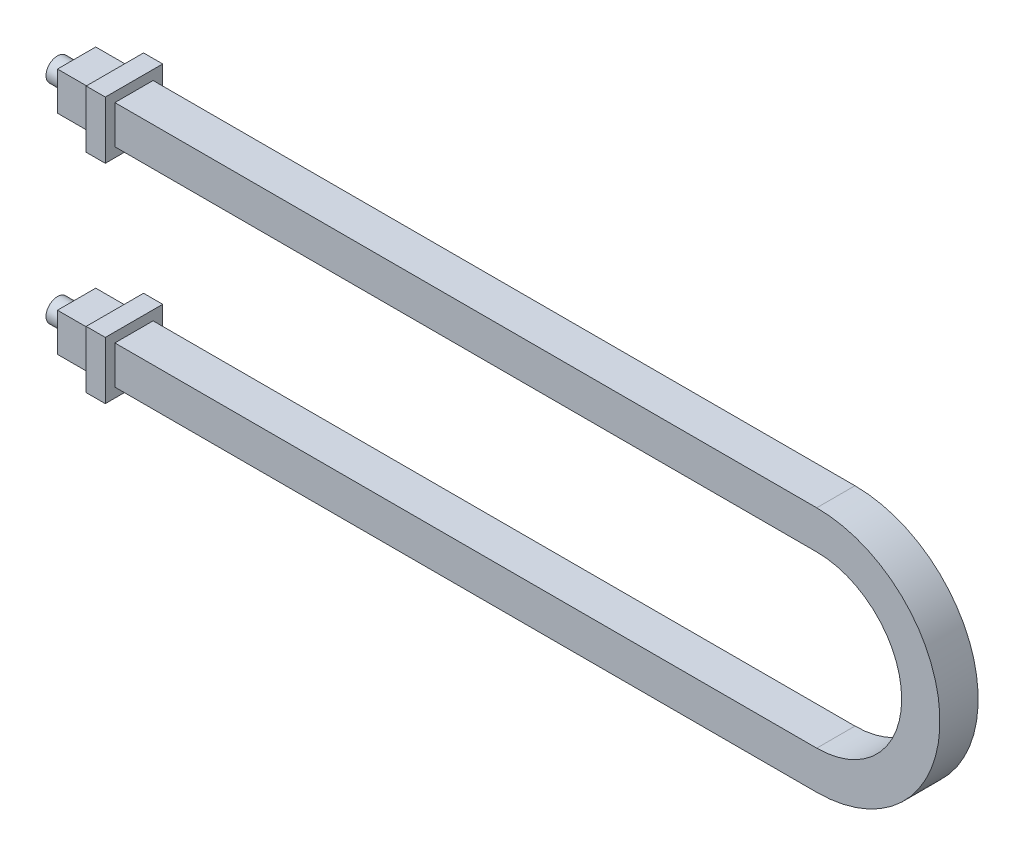
ISO-10303-21;
HEADER;
FILE_DESCRIPTION(('STEP AP214'),'2;1');
FILE_NAME('part.step','',(''),(''),'','','');
FILE_SCHEMA(('AUTOMOTIVE_DESIGN { 1 0 10303 214 1 1 1 1 }'));
ENDSEC;
DATA;
#1=APPLICATION_CONTEXT('core data for automotive mechanical design processes');
#2=APPLICATION_PROTOCOL_DEFINITION('international standard','automotive_design',2000,#1);
#3=PRODUCT_CONTEXT('',#1,'mechanical');
#4=PRODUCT('Part','Part','',(#3));
#5=PRODUCT_RELATED_PRODUCT_CATEGORY('part','',(#4));
#6=PRODUCT_DEFINITION_FORMATION('','',#4);
#7=PRODUCT_DEFINITION_CONTEXT('part definition',#1,'design');
#8=PRODUCT_DEFINITION('design','',#6,#7);
#9=PRODUCT_DEFINITION_SHAPE('','',#8);
#10=(LENGTH_UNIT() NAMED_UNIT(*) SI_UNIT(.MILLI.,.METRE.));
#11=(NAMED_UNIT(*) PLANE_ANGLE_UNIT() SI_UNIT($,.RADIAN.));
#12=(NAMED_UNIT(*) SI_UNIT($,.STERADIAN.) SOLID_ANGLE_UNIT());
#13=UNCERTAINTY_MEASURE_WITH_UNIT(LENGTH_MEASURE(1.E-05),#10,'distance_accuracy_value','');
#14=(GEOMETRIC_REPRESENTATION_CONTEXT(3) GLOBAL_UNCERTAINTY_ASSIGNED_CONTEXT((#13)) GLOBAL_UNIT_ASSIGNED_CONTEXT((#10,
#11,#12)) REPRESENTATION_CONTEXT('',''));
#15=CARTESIAN_POINT('',(0.,0.,0.));
#16=DIRECTION('',(0.,0.,1.));
#17=DIRECTION('',(1.,0.,0.));
#18=AXIS2_PLACEMENT_3D('',#15,#16,#17);
#19=CARTESIAN_POINT('',(0.,-54.4096844460773,10.));
#20=DIRECTION('',(1.,0.,0.));
#21=DIRECTION('',(0.,0.,-1.));
#22=AXIS2_PLACEMENT_3D('',#19,#20,#21);
#23=PLANE('',#22);
#24=DIRECTION('',(0.,1.,0.));
#25=VECTOR('',#24,1.);
#26=CARTESIAN_POINT('',(0.,-66.9096844460773,-2.5));
#27=LINE('',#26,#25);
#28=CARTESIAN_POINT('',(0.,-66.9096844460773,-2.5));
#29=VERTEX_POINT('',#28);
#30=CARTESIAN_POINT('',(0.,-51.9096844460773,-2.5));
#31=VERTEX_POINT('',#30);
#32=EDGE_CURVE('E284',#29,#31,#27,.T.);
#33=ORIENTED_EDGE('',*,*,#32,.F.);
#34=DIRECTION('',(0.,0.,-1.));
#35=VECTOR('',#34,1.);
#36=CARTESIAN_POINT('',(0.,-66.9096844460773,-2.5));
#37=LINE('',#36,#35);
#38=CARTESIAN_POINT('',(0.,-66.9096844460773,12.5));
#39=VERTEX_POINT('',#38);
#40=EDGE_CURVE('E277',#39,#29,#37,.T.);
#41=ORIENTED_EDGE('',*,*,#40,.F.);
#42=DIRECTION('',(0.,-1.,0.));
#43=VECTOR('',#42,1.);
#44=CARTESIAN_POINT('',(0.,-66.9096844460773,12.5));
#45=LINE('',#44,#43);
#46=CARTESIAN_POINT('',(0.,-51.9096844460773,12.5));
#47=VERTEX_POINT('',#46);
#48=EDGE_CURVE('E279',#47,#39,#45,.T.);
#49=ORIENTED_EDGE('',*,*,#48,.F.);
#50=DIRECTION('',(0.,0.,1.));
#51=VECTOR('',#50,1.);
#52=CARTESIAN_POINT('',(0.,-51.9096844460773,-2.5));
#53=LINE('',#52,#51);
#54=EDGE_CURVE('E282',#31,#47,#53,.T.);
#55=ORIENTED_EDGE('',*,*,#54,.F.);
#56=EDGE_LOOP('',(#33,#41,#49,#55));
#57=FACE_BOUND('',#56,.T.);
#58=DIRECTION('',(0.,-1.,0.));
#59=VECTOR('',#58,1.);
#60=CARTESIAN_POINT('',(0.,-64.5027045373639,0.));
#61=LINE('',#60,#59);
#62=CARTESIAN_POINT('',(0.,-54.5027045373639,0.));
#63=VERTEX_POINT('',#62);
#64=CARTESIAN_POINT('',(0.,-64.5027045373639,0.));
#65=VERTEX_POINT('',#64);
#66=EDGE_CURVE('E194',#63,#65,#61,.T.);
#67=ORIENTED_EDGE('',*,*,#66,.F.);
#68=DIRECTION('',(0.,0.,-1.));
#69=VECTOR('',#68,1.);
#70=CARTESIAN_POINT('',(0.,-54.5027045373639,0.));
#71=LINE('',#70,#69);
#72=CARTESIAN_POINT('',(0.,-54.5027045373639,10.));
#73=VERTEX_POINT('',#72);
#74=EDGE_CURVE('E196',#73,#63,#71,.T.);
#75=ORIENTED_EDGE('',*,*,#74,.F.);
#76=DIRECTION('',(0.,1.,0.));
#77=VECTOR('',#76,1.);
#78=CARTESIAN_POINT('',(0.,-64.5027045373639,10.));
#79=LINE('',#78,#77);
#80=CARTESIAN_POINT('',(0.,-64.5027045373639,10.));
#81=VERTEX_POINT('',#80);
#82=EDGE_CURVE('E57',#81,#73,#79,.T.);
#83=ORIENTED_EDGE('',*,*,#82,.F.);
#84=DIRECTION('',(0.,0.,1.));
#85=VECTOR('',#84,1.);
#86=CARTESIAN_POINT('',(0.,-64.5027045373639,0.));
#87=LINE('',#86,#85);
#88=EDGE_CURVE('E52',#65,#81,#87,.T.);
#89=ORIENTED_EDGE('',*,*,#88,.F.);
#90=EDGE_LOOP('',(#67,#75,#83,#89));
#91=FACE_BOUND('',#90,.T.);
#92=ADVANCED_FACE('F37',(#57,#91),#23,.F.);
#93=CARTESIAN_POINT('',(0.,-10.,10.));
#94=DIRECTION('',(0.,1.,0.));
#95=DIRECTION('',(0.,0.,1.));
#96=AXIS2_PLACEMENT_3D('',#93,#94,#95);
#97=PLANE('',#96);
#98=DIRECTION('',(0.,0.,1.));
#99=VECTOR('',#98,1.);
#100=CARTESIAN_POINT('',(4.99999999999999,-10.,10.));
#101=LINE('',#100,#99);
#102=CARTESIAN_POINT('',(5.,-10.,0.));
#103=VERTEX_POINT('',#102);
#104=CARTESIAN_POINT('',(4.99999999999999,-10.,10.));
#105=VERTEX_POINT('',#104);
#106=EDGE_CURVE('E260',#103,#105,#101,.T.);
#107=ORIENTED_EDGE('',*,*,#106,.F.);
#108=DIRECTION('',(1.,0.,0.));
#109=VECTOR('',#108,1.);
#110=CARTESIAN_POINT('',(0.,-10.,0.));
#111=LINE('',#110,#109);
#112=CARTESIAN_POINT('',(188.467924538912,-10.,0.));
#113=VERTEX_POINT('',#112);
#114=EDGE_CURVE('E340',#103,#113,#111,.T.);
#115=ORIENTED_EDGE('',*,*,#114,.T.);
#116=DIRECTION('',(0.,0.,-1.));
#117=VECTOR('',#116,1.);
#118=CARTESIAN_POINT('',(188.467924538912,-10.,10.));
#119=LINE('',#118,#117);
#120=CARTESIAN_POINT('',(188.467924538912,-10.,10.));
#121=VERTEX_POINT('',#120);
#122=EDGE_CURVE('E377',#121,#113,#119,.T.);
#123=ORIENTED_EDGE('',*,*,#122,.F.);
#124=DIRECTION('',(1.,0.,0.));
#125=VECTOR('',#124,1.);
#126=CARTESIAN_POINT('',(0.,-10.,10.));
#127=LINE('',#126,#125);
#128=EDGE_CURVE('E341',#105,#121,#127,.T.);
#129=ORIENTED_EDGE('',*,*,#128,.F.);
#130=EDGE_LOOP('',(#107,#115,#123,#129));
#131=FACE_BOUND('',#130,.T.);
#132=ADVANCED_FACE('F424',(#131),#97,.F.);
#133=CARTESIAN_POINT('',(0.,0.,10.));
#134=DIRECTION('',(0.,-1.,0.));
#135=DIRECTION('',(0.,0.,-1.));
#136=AXIS2_PLACEMENT_3D('',#133,#134,#135);
#137=PLANE('',#136);
#138=DIRECTION('',(0.,0.,-1.));
#139=VECTOR('',#138,1.);
#140=CARTESIAN_POINT('',(4.99999999999999,0.,10.));
#141=LINE('',#140,#139);
#142=CARTESIAN_POINT('',(4.99999999999999,0.,10.));
#143=VERTEX_POINT('',#142);
#144=CARTESIAN_POINT('',(5.,0.,0.));
#145=VERTEX_POINT('',#144);
#146=EDGE_CURVE('E258',#143,#145,#141,.T.);
#147=ORIENTED_EDGE('',*,*,#146,.F.);
#148=DIRECTION('',(-1.,0.,0.));
#149=VECTOR('',#148,1.);
#150=CARTESIAN_POINT('',(0.,0.,10.));
#151=LINE('',#150,#149);
#152=CARTESIAN_POINT('',(188.467924538912,0.,10.));
#153=VERTEX_POINT('',#152);
#154=EDGE_CURVE('E353',#153,#143,#151,.T.);
#155=ORIENTED_EDGE('',*,*,#154,.F.);
#156=DIRECTION('',(0.,0.,-1.));
#157=VECTOR('',#156,1.);
#158=CARTESIAN_POINT('',(188.467924538912,0.,10.));
#159=LINE('',#158,#157);
#160=CARTESIAN_POINT('',(188.467924538912,0.,0.));
#161=VERTEX_POINT('',#160);
#162=EDGE_CURVE('E356',#153,#161,#159,.T.);
#163=ORIENTED_EDGE('',*,*,#162,.T.);
#164=DIRECTION('',(-1.,0.,0.));
#165=VECTOR('',#164,1.);
#166=CARTESIAN_POINT('',(0.,0.,0.));
#167=LINE('',#166,#165);
#168=EDGE_CURVE('E344',#161,#145,#167,.T.);
#169=ORIENTED_EDGE('',*,*,#168,.T.);
#170=EDGE_LOOP('',(#147,#155,#163,#169));
#171=FACE_BOUND('',#170,.T.);
#172=ADVANCED_FACE('F395',(#171),#137,.F.);
#173=CARTESIAN_POINT('',(188.467924538912,-32.2048422230386,10.));
#174=DIRECTION('',(0.,0.,-1.));
#175=DIRECTION('',(-1.,0.,0.));
#176=AXIS2_PLACEMENT_3D('',#173,#174,#175);
#177=PLANE('',#176);
#178=DIRECTION('',(0.,1.,0.));
#179=VECTOR('',#178,1.);
#180=CARTESIAN_POINT('',(5.,-32.2048422230386,10.));
#181=LINE('',#180,#179);
#182=EDGE_CURVE('E262',#105,#143,#181,.T.);
#183=ORIENTED_EDGE('',*,*,#182,.F.);
#184=ORIENTED_EDGE('',*,*,#128,.T.);
#185=CARTESIAN_POINT('',(188.467924538912,-32.2048422230386,10.));
#186=DIRECTION('',(0.,0.,-1.));
#187=DIRECTION('',(-1.,0.,0.));
#188=AXIS2_PLACEMENT_3D('',#185,#186,#187);
#189=CIRCLE('',#188,22.2048422230386);
#190=CARTESIAN_POINT('',(188.467924538912,-54.4096844460773,10.));
#191=VERTEX_POINT('',#190);
#192=EDGE_CURVE('E343',#121,#191,#189,.T.);
#193=ORIENTED_EDGE('',*,*,#192,.T.);
#194=DIRECTION('',(-1.,0.,0.));
#195=VECTOR('',#194,1.);
#196=CARTESIAN_POINT('',(188.467924538912,-54.4096844460773,10.));
#197=LINE('',#196,#195);
#198=CARTESIAN_POINT('',(5.00000000000006,-54.4096844460773,10.));
#199=VERTEX_POINT('',#198);
#200=EDGE_CURVE('E346',#191,#199,#197,.T.);
#201=ORIENTED_EDGE('',*,*,#200,.T.);
#202=DIRECTION('',(0.,-1.,0.));
#203=VECTOR('',#202,1.);
#204=CARTESIAN_POINT('',(5.,-32.2048422230386,10.));
#205=LINE('',#204,#203);
#206=CARTESIAN_POINT('',(5.,-64.4096844460773,10.));
#207=VERTEX_POINT('',#206);
#208=EDGE_CURVE('E299',#199,#207,#205,.T.);
#209=ORIENTED_EDGE('',*,*,#208,.T.);
#210=DIRECTION('',(1.,0.,0.));
#211=VECTOR('',#210,1.);
#212=CARTESIAN_POINT('',(188.467924538912,-64.4096844460773,10.));
#213=LINE('',#212,#211);
#214=CARTESIAN_POINT('',(188.467924538912,-64.4096844460773,10.));
#215=VERTEX_POINT('',#214);
#216=EDGE_CURVE('E349',#207,#215,#213,.T.);
#217=ORIENTED_EDGE('',*,*,#216,.T.);
#218=CARTESIAN_POINT('',(188.467924538912,-32.2048422230386,10.));
#219=DIRECTION('',(0.,0.,1.));
#220=DIRECTION('',(-1.,0.,0.));
#221=AXIS2_PLACEMENT_3D('',#218,#219,#220);
#222=CIRCLE('',#221,32.2048422230386);
#223=EDGE_CURVE('E351',#215,#153,#222,.T.);
#224=ORIENTED_EDGE('',*,*,#223,.T.);
#225=ORIENTED_EDGE('',*,*,#154,.T.);
#226=EDGE_LOOP('',(#183,#184,#193,#201,#209,#217,#224,#225));
#227=FACE_BOUND('',#226,.T.);
#228=ADVANCED_FACE('F416',(#227),#177,.F.);
#229=CARTESIAN_POINT('',(188.467924538912,-32.2048422230386,0.));
#230=DIRECTION('',(0.,0.,-1.));
#231=DIRECTION('',(-1.,0.,0.));
#232=AXIS2_PLACEMENT_3D('',#229,#230,#231);
#233=PLANE('',#232);
#234=ORIENTED_EDGE('',*,*,#114,.F.);
#235=DIRECTION('',(0.,1.,0.));
#236=VECTOR('',#235,1.);
#237=CARTESIAN_POINT('',(5.,-32.2048422230386,0.));
#238=LINE('',#237,#236);
#239=EDGE_CURVE('E45',#103,#145,#238,.T.);
#240=ORIENTED_EDGE('',*,*,#239,.T.);
#241=ORIENTED_EDGE('',*,*,#168,.F.);
#242=CARTESIAN_POINT('',(188.467924538912,-32.2048422230386,0.));
#243=DIRECTION('',(0.,0.,1.));
#244=DIRECTION('',(-1.,0.,0.));
#245=AXIS2_PLACEMENT_3D('',#242,#243,#244);
#246=CIRCLE('',#245,32.2048422230386);
#247=CARTESIAN_POINT('',(188.467924538912,-64.4096844460773,0.));
#248=VERTEX_POINT('',#247);
#249=EDGE_CURVE('E365',#248,#161,#246,.T.);
#250=ORIENTED_EDGE('',*,*,#249,.F.);
#251=DIRECTION('',(1.,0.,0.));
#252=VECTOR('',#251,1.);
#253=CARTESIAN_POINT('',(188.467924538912,-64.4096844460773,0.));
#254=LINE('',#253,#252);
#255=CARTESIAN_POINT('',(5.,-64.4096844460773,0.));
#256=VERTEX_POINT('',#255);
#257=EDGE_CURVE('E363',#256,#248,#254,.T.);
#258=ORIENTED_EDGE('',*,*,#257,.F.);
#259=DIRECTION('',(0.,-1.,0.));
#260=VECTOR('',#259,1.);
#261=CARTESIAN_POINT('',(5.,-32.2048422230386,0.));
#262=LINE('',#261,#260);
#263=CARTESIAN_POINT('',(5.00000000000006,-54.4096844460773,0.));
#264=VERTEX_POINT('',#263);
#265=EDGE_CURVE('E380',#264,#256,#262,.T.);
#266=ORIENTED_EDGE('',*,*,#265,.F.);
#267=DIRECTION('',(-1.,0.,0.));
#268=VECTOR('',#267,1.);
#269=CARTESIAN_POINT('',(188.467924538912,-54.4096844460773,0.));
#270=LINE('',#269,#268);
#271=CARTESIAN_POINT('',(188.467924538912,-54.4096844460773,0.));
#272=VERTEX_POINT('',#271);
#273=EDGE_CURVE('E360',#272,#264,#270,.T.);
#274=ORIENTED_EDGE('',*,*,#273,.F.);
#275=CARTESIAN_POINT('',(188.467924538912,-32.2048422230386,0.));
#276=DIRECTION('',(0.,0.,-1.));
#277=DIRECTION('',(-1.,0.,0.));
#278=AXIS2_PLACEMENT_3D('',#275,#276,#277);
#279=CIRCLE('',#278,22.2048422230386);
#280=EDGE_CURVE('E358',#113,#272,#279,.T.);
#281=ORIENTED_EDGE('',*,*,#280,.F.);
#282=EDGE_LOOP('',(#234,#240,#241,#250,#258,#266,#274,#281));
#283=FACE_BOUND('',#282,.T.);
#284=ADVANCED_FACE('F388',(#283),#233,.T.);
#285=CARTESIAN_POINT('',(188.467924538912,-32.2048422230386,10.));
#286=DIRECTION('',(0.,0.,-1.));
#287=DIRECTION('',(-1.,0.,0.));
#288=AXIS2_PLACEMENT_3D('',#285,#286,#287);
#289=CYLINDRICAL_SURFACE('',#288,22.2048422230386);
#290=ORIENTED_EDGE('',*,*,#280,.T.);
#291=DIRECTION('',(0.,0.,-1.));
#292=VECTOR('',#291,1.);
#293=CARTESIAN_POINT('',(188.467924538912,-54.4096844460773,10.));
#294=LINE('',#293,#292);
#295=EDGE_CURVE('E374',#191,#272,#294,.T.);
#296=ORIENTED_EDGE('',*,*,#295,.F.);
#297=ORIENTED_EDGE('',*,*,#192,.F.);
#298=ORIENTED_EDGE('',*,*,#122,.T.);
#299=EDGE_LOOP('',(#290,#296,#297,#298));
#300=FACE_BOUND('',#299,.T.);
#301=ADVANCED_FACE('F422',(#300),#289,.F.);
#302=CARTESIAN_POINT('',(188.467924538912,-54.4096844460773,10.));
#303=DIRECTION('',(0.,-1.,0.));
#304=DIRECTION('',(0.,0.,-1.));
#305=AXIS2_PLACEMENT_3D('',#302,#303,#304);
#306=PLANE('',#305);
#307=ORIENTED_EDGE('',*,*,#273,.T.);
#308=DIRECTION('',(0.,0.,1.));
#309=VECTOR('',#308,1.);
#310=CARTESIAN_POINT('',(5.,-54.4096844460773,10.));
#311=LINE('',#310,#309);
#312=EDGE_CURVE('E297',#264,#199,#311,.T.);
#313=ORIENTED_EDGE('',*,*,#312,.T.);
#314=ORIENTED_EDGE('',*,*,#200,.F.);
#315=ORIENTED_EDGE('',*,*,#295,.T.);
#316=EDGE_LOOP('',(#307,#313,#314,#315));
#317=FACE_BOUND('',#316,.T.);
#318=ADVANCED_FACE('F413',(#317),#306,.F.);
#319=CARTESIAN_POINT('',(188.467924538912,-64.4096844460773,10.));
#320=DIRECTION('',(0.,1.,0.));
#321=DIRECTION('',(0.,0.,1.));
#322=AXIS2_PLACEMENT_3D('',#319,#320,#321);
#323=PLANE('',#322);
#324=ORIENTED_EDGE('',*,*,#216,.F.);
#325=DIRECTION('',(0.,0.,-1.));
#326=VECTOR('',#325,1.);
#327=CARTESIAN_POINT('',(5.,-64.4096844460773,10.));
#328=LINE('',#327,#326);
#329=EDGE_CURVE('E287',#207,#256,#328,.T.);
#330=ORIENTED_EDGE('',*,*,#329,.T.);
#331=ORIENTED_EDGE('',*,*,#257,.T.);
#332=DIRECTION('',(0.,0.,-1.));
#333=VECTOR('',#332,1.);
#334=CARTESIAN_POINT('',(188.467924538912,-64.4096844460773,10.));
#335=LINE('',#334,#333);
#336=EDGE_CURVE('E371',#215,#248,#335,.T.);
#337=ORIENTED_EDGE('',*,*,#336,.F.);
#338=EDGE_LOOP('',(#324,#330,#331,#337));
#339=FACE_BOUND('',#338,.T.);
#340=ADVANCED_FACE('F406',(#339),#323,.F.);
#341=CARTESIAN_POINT('',(188.467924538912,-32.2048422230386,10.));
#342=DIRECTION('',(0.,0.,-1.));
#343=DIRECTION('',(-1.,0.,0.));
#344=AXIS2_PLACEMENT_3D('',#341,#342,#343);
#345=CYLINDRICAL_SURFACE('',#344,32.2048422230386);
#346=ORIENTED_EDGE('',*,*,#249,.T.);
#347=ORIENTED_EDGE('',*,*,#162,.F.);
#348=ORIENTED_EDGE('',*,*,#223,.F.);
#349=ORIENTED_EDGE('',*,*,#336,.T.);
#350=EDGE_LOOP('',(#346,#347,#348,#349));
#351=FACE_BOUND('',#350,.T.);
#352=ADVANCED_FACE('F400',(#351),#345,.T.);
#353=CARTESIAN_POINT('',(4.99999999999999,0.,0.));
#354=DIRECTION('',(1.,0.,0.));
#355=DIRECTION('',(0.,0.,-1.));
#356=AXIS2_PLACEMENT_3D('',#353,#354,#355);
#357=PLANE('',#356);
#358=DIRECTION('',(0.,1.,0.));
#359=VECTOR('',#358,1.);
#360=CARTESIAN_POINT('',(4.99999999999999,-66.9096844460773,-2.5));
#361=LINE('',#360,#359);
#362=CARTESIAN_POINT('',(4.99999999999999,-66.9096844460773,-2.5));
#363=VERTEX_POINT('',#362);
#364=CARTESIAN_POINT('',(4.99999999999999,-51.9096844460773,-2.5));
#365=VERTEX_POINT('',#364);
#366=EDGE_CURVE('E280',#363,#365,#361,.T.);
#367=ORIENTED_EDGE('',*,*,#366,.T.);
#368=DIRECTION('',(0.,0.,1.));
#369=VECTOR('',#368,1.);
#370=CARTESIAN_POINT('',(4.99999999999999,-51.9096844460773,-2.5));
#371=LINE('',#370,#369);
#372=CARTESIAN_POINT('',(4.99999999999999,-51.9096844460773,12.5));
#373=VERTEX_POINT('',#372);
#374=EDGE_CURVE('E291',#365,#373,#371,.T.);
#375=ORIENTED_EDGE('',*,*,#374,.T.);
#376=DIRECTION('',(0.,-1.,0.));
#377=VECTOR('',#376,1.);
#378=CARTESIAN_POINT('',(4.99999999999999,-66.9096844460773,12.5));
#379=LINE('',#378,#377);
#380=CARTESIAN_POINT('',(4.99999999999999,-66.9096844460773,12.5));
#381=VERTEX_POINT('',#380);
#382=EDGE_CURVE('E289',#373,#381,#379,.T.);
#383=ORIENTED_EDGE('',*,*,#382,.T.);
#384=DIRECTION('',(0.,0.,-1.));
#385=VECTOR('',#384,1.);
#386=CARTESIAN_POINT('',(4.99999999999999,-66.9096844460773,-2.5));
#387=LINE('',#386,#385);
#388=EDGE_CURVE('E276',#381,#363,#387,.T.);
#389=ORIENTED_EDGE('',*,*,#388,.T.);
#390=EDGE_LOOP('',(#367,#375,#383,#389));
#391=FACE_BOUND('',#390,.T.);
#392=ORIENTED_EDGE('',*,*,#208,.F.);
#393=ORIENTED_EDGE('',*,*,#312,.F.);
#394=ORIENTED_EDGE('',*,*,#265,.T.);
#395=ORIENTED_EDGE('',*,*,#329,.F.);
#396=EDGE_LOOP('',(#392,#393,#394,#395));
#397=FACE_BOUND('',#396,.T.);
#398=ADVANCED_FACE('F410',(#391,#397),#357,.T.);
#399=CARTESIAN_POINT('',(4.99999999999999,-66.9096844460773,-2.5));
#400=DIRECTION('',(0.,0.,1.));
#401=DIRECTION('',(0.,-1.,0.));
#402=AXIS2_PLACEMENT_3D('',#399,#400,#401);
#403=PLANE('',#402);
#404=ORIENTED_EDGE('',*,*,#32,.T.);
#405=DIRECTION('',(-1.,0.,0.));
#406=VECTOR('',#405,1.);
#407=CARTESIAN_POINT('',(4.99999999999999,-51.9096844460773,-2.5));
#408=LINE('',#407,#406);
#409=EDGE_CURVE('E264',#365,#31,#408,.T.);
#410=ORIENTED_EDGE('',*,*,#409,.F.);
#411=ORIENTED_EDGE('',*,*,#366,.F.);
#412=DIRECTION('',(-1.,0.,0.));
#413=VECTOR('',#412,1.);
#414=CARTESIAN_POINT('',(4.99999999999999,-66.9096844460773,-2.5));
#415=LINE('',#414,#413);
#416=EDGE_CURVE('E273',#363,#29,#415,.T.);
#417=ORIENTED_EDGE('',*,*,#416,.T.);
#418=EDGE_LOOP('',(#404,#410,#411,#417));
#419=FACE_BOUND('',#418,.T.);
#420=ADVANCED_FACE('F670',(#419),#403,.F.);
#421=CARTESIAN_POINT('',(4.99999999999999,-51.9096844460773,-2.5));
#422=DIRECTION('',(0.,-1.,0.));
#423=DIRECTION('',(0.,0.,-1.));
#424=AXIS2_PLACEMENT_3D('',#421,#422,#423);
#425=PLANE('',#424);
#426=ORIENTED_EDGE('',*,*,#54,.T.);
#427=DIRECTION('',(-1.,0.,0.));
#428=VECTOR('',#427,1.);
#429=CARTESIAN_POINT('',(4.99999999999999,-51.9096844460773,12.5));
#430=LINE('',#429,#428);
#431=EDGE_CURVE('E267',#373,#47,#430,.T.);
#432=ORIENTED_EDGE('',*,*,#431,.F.);
#433=ORIENTED_EDGE('',*,*,#374,.F.);
#434=ORIENTED_EDGE('',*,*,#409,.T.);
#435=EDGE_LOOP('',(#426,#432,#433,#434));
#436=FACE_BOUND('',#435,.T.);
#437=ADVANCED_FACE('F681',(#436),#425,.F.);
#438=CARTESIAN_POINT('',(4.99999999999999,-66.9096844460773,12.5));
#439=DIRECTION('',(0.,0.,-1.));
#440=DIRECTION('',(0.,1.,0.));
#441=AXIS2_PLACEMENT_3D('',#438,#439,#440);
#442=PLANE('',#441);
#443=ORIENTED_EDGE('',*,*,#48,.T.);
#444=DIRECTION('',(-1.,0.,0.));
#445=VECTOR('',#444,1.);
#446=CARTESIAN_POINT('',(4.99999999999999,-66.9096844460773,12.5));
#447=LINE('',#446,#445);
#448=EDGE_CURVE('E270',#381,#39,#447,.T.);
#449=ORIENTED_EDGE('',*,*,#448,.F.);
#450=ORIENTED_EDGE('',*,*,#382,.F.);
#451=ORIENTED_EDGE('',*,*,#431,.T.);
#452=EDGE_LOOP('',(#443,#449,#450,#451));
#453=FACE_BOUND('',#452,.T.);
#454=ADVANCED_FACE('F438',(#453),#442,.F.);
#455=CARTESIAN_POINT('',(4.99999999999999,-66.9096844460773,-2.5));
#456=DIRECTION('',(0.,1.,0.));
#457=DIRECTION('',(0.,0.,1.));
#458=AXIS2_PLACEMENT_3D('',#455,#456,#457);
#459=PLANE('',#458);
#460=ORIENTED_EDGE('',*,*,#40,.T.);
#461=ORIENTED_EDGE('',*,*,#416,.F.);
#462=ORIENTED_EDGE('',*,*,#388,.F.);
#463=ORIENTED_EDGE('',*,*,#448,.T.);
#464=EDGE_LOOP('',(#460,#461,#462,#463));
#465=FACE_BOUND('',#464,.T.);
#466=ADVANCED_FACE('F428',(#465),#459,.F.);
#467=CARTESIAN_POINT('',(4.99999999999999,0.,0.));
#468=DIRECTION('',(-1.,0.,0.));
#469=DIRECTION('',(0.,0.,1.));
#470=AXIS2_PLACEMENT_3D('',#467,#468,#469);
#471=PLANE('',#470);
#472=DIRECTION('',(0.,-1.,0.));
#473=VECTOR('',#472,1.);
#474=CARTESIAN_POINT('',(4.99999999999999,2.5,12.5));
#475=LINE('',#474,#473);
#476=CARTESIAN_POINT('',(4.99999999999999,2.5,12.5));
#477=VERTEX_POINT('',#476);
#478=CARTESIAN_POINT('',(4.99999999999999,-12.5,12.5));
#479=VERTEX_POINT('',#478);
#480=EDGE_CURVE('E229',#477,#479,#475,.T.);
#481=ORIENTED_EDGE('',*,*,#480,.T.);
#482=DIRECTION('',(0.,0.,-1.));
#483=VECTOR('',#482,1.);
#484=CARTESIAN_POINT('',(4.99999999999999,-12.5,-2.5));
#485=LINE('',#484,#483);
#486=CARTESIAN_POINT('',(4.99999999999999,-12.5,-2.5));
#487=VERTEX_POINT('',#486);
#488=EDGE_CURVE('E232',#479,#487,#485,.T.);
#489=ORIENTED_EDGE('',*,*,#488,.T.);
#490=DIRECTION('',(0.,1.,0.));
#491=VECTOR('',#490,1.);
#492=CARTESIAN_POINT('',(4.99999999999999,2.5,-2.5));
#493=LINE('',#492,#491);
#494=CARTESIAN_POINT('',(4.99999999999999,2.5,-2.5));
#495=VERTEX_POINT('',#494);
#496=EDGE_CURVE('E235',#487,#495,#493,.T.);
#497=ORIENTED_EDGE('',*,*,#496,.T.);
#498=DIRECTION('',(0.,0.,1.));
#499=VECTOR('',#498,1.);
#500=CARTESIAN_POINT('',(4.99999999999999,2.5,-2.5));
#501=LINE('',#500,#499);
#502=EDGE_CURVE('E237',#495,#477,#501,.T.);
#503=ORIENTED_EDGE('',*,*,#502,.T.);
#504=EDGE_LOOP('',(#481,#489,#497,#503));
#505=FACE_BOUND('',#504,.T.);
#506=ORIENTED_EDGE('',*,*,#106,.T.);
#507=ORIENTED_EDGE('',*,*,#182,.T.);
#508=ORIENTED_EDGE('',*,*,#146,.T.);
#509=ORIENTED_EDGE('',*,*,#239,.F.);
#510=EDGE_LOOP('',(#506,#507,#508,#509));
#511=FACE_BOUND('',#510,.T.);
#512=ADVANCED_FACE('F425',(#505,#511),#471,.F.);
#513=CARTESIAN_POINT('',(4.99999999999999,2.5,12.5));
#514=DIRECTION('',(0.,0.,-1.));
#515=DIRECTION('',(0.,1.,0.));
#516=AXIS2_PLACEMENT_3D('',#513,#514,#515);
#517=PLANE('',#516);
#518=DIRECTION('',(0.,-1.,0.));
#519=VECTOR('',#518,1.);
#520=CARTESIAN_POINT('',(0.,2.5,12.5));
#521=LINE('',#520,#519);
#522=CARTESIAN_POINT('',(0.,2.5,12.5));
#523=VERTEX_POINT('',#522);
#524=CARTESIAN_POINT('',(0.,-12.5,12.5));
#525=VERTEX_POINT('',#524);
#526=EDGE_CURVE('E200',#523,#525,#521,.T.);
#527=ORIENTED_EDGE('',*,*,#526,.T.);
#528=DIRECTION('',(-1.,0.,0.));
#529=VECTOR('',#528,1.);
#530=CARTESIAN_POINT('',(4.99999999999999,-12.5,12.5));
#531=LINE('',#530,#529);
#532=EDGE_CURVE('E255',#479,#525,#531,.T.);
#533=ORIENTED_EDGE('',*,*,#532,.F.);
#534=ORIENTED_EDGE('',*,*,#480,.F.);
#535=DIRECTION('',(-1.,0.,0.));
#536=VECTOR('',#535,1.);
#537=CARTESIAN_POINT('',(4.99999999999999,2.5,12.5));
#538=LINE('',#537,#536);
#539=EDGE_CURVE('E239',#477,#523,#538,.T.);
#540=ORIENTED_EDGE('',*,*,#539,.T.);
#541=EDGE_LOOP('',(#527,#533,#534,#540));
#542=FACE_BOUND('',#541,.T.);
#543=ADVANCED_FACE('F427',(#542),#517,.F.);
#544=CARTESIAN_POINT('',(4.99999999999999,-12.5,-2.5));
#545=DIRECTION('',(0.,1.,0.));
#546=DIRECTION('',(0.,0.,1.));
#547=AXIS2_PLACEMENT_3D('',#544,#545,#546);
#548=PLANE('',#547);
#549=DIRECTION('',(0.,0.,-1.));
#550=VECTOR('',#549,1.);
#551=CARTESIAN_POINT('',(0.,-12.5,-2.5));
#552=LINE('',#551,#550);
#553=CARTESIAN_POINT('',(0.,-12.5,-2.5));
#554=VERTEX_POINT('',#553);
#555=EDGE_CURVE('E242',#525,#554,#552,.T.);
#556=ORIENTED_EDGE('',*,*,#555,.T.);
#557=DIRECTION('',(-1.,0.,0.));
#558=VECTOR('',#557,1.);
#559=CARTESIAN_POINT('',(4.99999999999999,-12.5,-2.5));
#560=LINE('',#559,#558);
#561=EDGE_CURVE('E252',#487,#554,#560,.T.);
#562=ORIENTED_EDGE('',*,*,#561,.F.);
#563=ORIENTED_EDGE('',*,*,#488,.F.);
#564=ORIENTED_EDGE('',*,*,#532,.T.);
#565=EDGE_LOOP('',(#556,#562,#563,#564));
#566=FACE_BOUND('',#565,.T.);
#567=ADVANCED_FACE('F435',(#566),#548,.F.);
#568=CARTESIAN_POINT('',(4.99999999999999,2.5,-2.5));
#569=DIRECTION('',(0.,0.,1.));
#570=DIRECTION('',(0.,-1.,0.));
#571=AXIS2_PLACEMENT_3D('',#568,#569,#570);
#572=PLANE('',#571);
#573=DIRECTION('',(0.,1.,0.));
#574=VECTOR('',#573,1.);
#575=CARTESIAN_POINT('',(0.,2.5,-2.5));
#576=LINE('',#575,#574);
#577=CARTESIAN_POINT('',(0.,2.5,-2.5));
#578=VERTEX_POINT('',#577);
#579=EDGE_CURVE('E244',#554,#578,#576,.T.);
#580=ORIENTED_EDGE('',*,*,#579,.T.);
#581=DIRECTION('',(-1.,0.,0.));
#582=VECTOR('',#581,1.);
#583=CARTESIAN_POINT('',(4.99999999999999,2.5,-2.5));
#584=LINE('',#583,#582);
#585=EDGE_CURVE('E249',#495,#578,#584,.T.);
#586=ORIENTED_EDGE('',*,*,#585,.F.);
#587=ORIENTED_EDGE('',*,*,#496,.F.);
#588=ORIENTED_EDGE('',*,*,#561,.T.);
#589=EDGE_LOOP('',(#580,#586,#587,#588));
#590=FACE_BOUND('',#589,.T.);
#591=ADVANCED_FACE('F725',(#590),#572,.F.);
#592=CARTESIAN_POINT('',(4.99999999999999,2.5,-2.5));
#593=DIRECTION('',(0.,-1.,0.));
#594=DIRECTION('',(0.,0.,-1.));
#595=AXIS2_PLACEMENT_3D('',#592,#593,#594);
#596=PLANE('',#595);
#597=DIRECTION('',(0.,0.,1.));
#598=VECTOR('',#597,1.);
#599=CARTESIAN_POINT('',(0.,2.5,-2.5));
#600=LINE('',#599,#598);
#601=EDGE_CURVE('E233',#578,#523,#600,.T.);
#602=ORIENTED_EDGE('',*,*,#601,.T.);
#603=ORIENTED_EDGE('',*,*,#539,.F.);
#604=ORIENTED_EDGE('',*,*,#502,.F.);
#605=ORIENTED_EDGE('',*,*,#585,.T.);
#606=EDGE_LOOP('',(#602,#603,#604,#605));
#607=FACE_BOUND('',#606,.T.);
#608=ADVANCED_FACE('F507',(#607),#596,.F.);
#609=CARTESIAN_POINT('',(-15.,-4.90697990871341,5.));
#610=DIRECTION('',(-1.,0.,0.));
#611=DIRECTION('',(0.,0.,1.));
#612=AXIS2_PLACEMENT_3D('',#609,#610,#611);
#613=PLANE('',#612);
#614=CARTESIAN_POINT('',(-15.,-4.90697990871341,5.));
#615=DIRECTION('',(-1.,0.,0.));
#616=DIRECTION('',(0.,0.,1.));
#617=AXIS2_PLACEMENT_3D('',#614,#615,#616);
#618=CIRCLE('',#617,3.);
#619=CARTESIAN_POINT('',(-15.,-4.90697990871341,8.));
#620=VERTEX_POINT('',#619);
#621=EDGE_CURVE('E337',#620,#620,#618,.T.);
#622=ORIENTED_EDGE('',*,*,#621,.T.);
#623=EDGE_LOOP('',(#622));
#624=FACE_BOUND('',#623,.T.);
#625=ADVANCED_FACE('F503',(#624),#613,.T.);
#626=CARTESIAN_POINT('',(-15.,-4.90697990871341,5.));
#627=DIRECTION('',(1.,0.,0.));
#628=DIRECTION('',(0.,0.,-1.));
#629=AXIS2_PLACEMENT_3D('',#626,#627,#628);
#630=CYLINDRICAL_SURFACE('',#629,3.);
#631=CARTESIAN_POINT('',(-9.99999999999999,-4.90697990871341,5.));
#632=DIRECTION('',(-1.,0.,0.));
#633=DIRECTION('',(0.,0.,1.));
#634=AXIS2_PLACEMENT_3D('',#631,#632,#633);
#635=CIRCLE('',#634,3.);
#636=CARTESIAN_POINT('',(-9.99999999999999,-4.90697990871341,8.));
#637=VERTEX_POINT('',#636);
#638=EDGE_CURVE('E336',#637,#637,#635,.T.);
#639=ORIENTED_EDGE('',*,*,#638,.T.);
#640=EDGE_LOOP('',(#639));
#641=FACE_BOUND('',#640,.T.);
#642=ORIENTED_EDGE('',*,*,#621,.F.);
#643=EDGE_LOOP('',(#642));
#644=FACE_BOUND('',#643,.T.);
#645=ADVANCED_FACE('F506',(#641,#644),#630,.T.);
#646=CARTESIAN_POINT('',(0.,-10.,10.));
#647=DIRECTION('',(1.,0.,0.));
#648=DIRECTION('',(0.,0.,-1.));
#649=AXIS2_PLACEMENT_3D('',#646,#647,#648);
#650=PLANE('',#649);
#651=DIRECTION('',(0.,0.,1.));
#652=VECTOR('',#651,1.);
#653=CARTESIAN_POINT('',(0.,-9.90697990871341,0.));
#654=LINE('',#653,#652);
#655=CARTESIAN_POINT('',(0.,-9.90697990871341,0.));
#656=VERTEX_POINT('',#655);
#657=CARTESIAN_POINT('',(0.,-9.90697990871341,10.));
#658=VERTEX_POINT('',#657);
#659=EDGE_CURVE('E309',#656,#658,#654,.T.);
#660=ORIENTED_EDGE('',*,*,#659,.F.);
#661=DIRECTION('',(0.,-1.,0.));
#662=VECTOR('',#661,1.);
#663=CARTESIAN_POINT('',(0.,0.0930200912865947,0.));
#664=LINE('',#663,#662);
#665=CARTESIAN_POINT('',(0.,0.0930200912865947,0.));
#666=VERTEX_POINT('',#665);
#667=EDGE_CURVE('E321',#666,#656,#664,.T.);
#668=ORIENTED_EDGE('',*,*,#667,.F.);
#669=DIRECTION('',(0.,0.,-1.));
#670=VECTOR('',#669,1.);
#671=CARTESIAN_POINT('',(0.,0.0930200912865947,0.));
#672=LINE('',#671,#670);
#673=CARTESIAN_POINT('',(0.,0.0930200912865956,10.));
#674=VERTEX_POINT('',#673);
#675=EDGE_CURVE('E318',#674,#666,#672,.T.);
#676=ORIENTED_EDGE('',*,*,#675,.F.);
#677=DIRECTION('',(0.,1.,0.));
#678=VECTOR('',#677,1.);
#679=CARTESIAN_POINT('',(0.,0.0930200912865947,10.));
#680=LINE('',#679,#678);
#681=EDGE_CURVE('E304',#658,#674,#680,.T.);
#682=ORIENTED_EDGE('',*,*,#681,.F.);
#683=EDGE_LOOP('',(#660,#668,#676,#682));
#684=FACE_BOUND('',#683,.T.);
#685=ORIENTED_EDGE('',*,*,#526,.F.);
#686=ORIENTED_EDGE('',*,*,#601,.F.);
#687=ORIENTED_EDGE('',*,*,#579,.F.);
#688=ORIENTED_EDGE('',*,*,#555,.F.);
#689=EDGE_LOOP('',(#685,#686,#687,#688));
#690=FACE_BOUND('',#689,.T.);
#691=ADVANCED_FACE('F39',(#684,#690),#650,.F.);
#692=CARTESIAN_POINT('',(-9.99999999999999,-9.90697990871341,0.));
#693=DIRECTION('',(0.,1.,0.));
#694=DIRECTION('',(0.,0.,1.));
#695=AXIS2_PLACEMENT_3D('',#692,#693,#694);
#696=PLANE('',#695);
#697=ORIENTED_EDGE('',*,*,#659,.T.);
#698=DIRECTION('',(1.,0.,0.));
#699=VECTOR('',#698,1.);
#700=CARTESIAN_POINT('',(-9.99999999999999,-9.90697990871341,10.));
#701=LINE('',#700,#699);
#702=CARTESIAN_POINT('',(-9.99999999999999,-9.90697990871341,10.));
#703=VERTEX_POINT('',#702);
#704=EDGE_CURVE('E315',#703,#658,#701,.T.);
#705=ORIENTED_EDGE('',*,*,#704,.F.);
#706=DIRECTION('',(0.,0.,1.));
#707=VECTOR('',#706,1.);
#708=CARTESIAN_POINT('',(-9.99999999999999,-9.90697990871341,0.));
#709=LINE('',#708,#707);
#710=CARTESIAN_POINT('',(-9.99999999999999,-9.90697990871341,0.));
#711=VERTEX_POINT('',#710);
#712=EDGE_CURVE('E313',#711,#703,#709,.T.);
#713=ORIENTED_EDGE('',*,*,#712,.F.);
#714=DIRECTION('',(1.,0.,0.));
#715=VECTOR('',#714,1.);
#716=CARTESIAN_POINT('',(-9.99999999999999,-9.90697990871341,0.));
#717=LINE('',#716,#715);
#718=EDGE_CURVE('E327',#711,#656,#717,.T.);
#719=ORIENTED_EDGE('',*,*,#718,.T.);
#720=EDGE_LOOP('',(#697,#705,#713,#719));
#721=FACE_BOUND('',#720,.T.);
#722=ADVANCED_FACE('F487',(#721),#696,.F.);
#723=CARTESIAN_POINT('',(-9.99999999999999,0.,0.));
#724=DIRECTION('',(-1.,0.,0.));
#725=DIRECTION('',(0.,0.,1.));
#726=AXIS2_PLACEMENT_3D('',#723,#724,#725);
#727=PLANE('',#726);
#728=ORIENTED_EDGE('',*,*,#638,.F.);
#729=EDGE_LOOP('',(#728));
#730=FACE_BOUND('',#729,.T.);
#731=DIRECTION('',(0.,1.,0.));
#732=VECTOR('',#731,1.);
#733=CARTESIAN_POINT('',(-9.99999999999999,0.0930200912865947,10.));
#734=LINE('',#733,#732);
#735=CARTESIAN_POINT('',(-9.99999999999999,0.0930200912865947,10.));
#736=VERTEX_POINT('',#735);
#737=EDGE_CURVE('E305',#703,#736,#734,.T.);
#738=ORIENTED_EDGE('',*,*,#737,.T.);
#739=DIRECTION('',(0.,0.,-1.));
#740=VECTOR('',#739,1.);
#741=CARTESIAN_POINT('',(-9.99999999999999,0.0930200912865947,0.));
#742=LINE('',#741,#740);
#743=CARTESIAN_POINT('',(-9.99999999999999,0.0930200912865947,0.));
#744=VERTEX_POINT('',#743);
#745=EDGE_CURVE('E308',#736,#744,#742,.T.);
#746=ORIENTED_EDGE('',*,*,#745,.T.);
#747=DIRECTION('',(0.,-1.,0.));
#748=VECTOR('',#747,1.);
#749=CARTESIAN_POINT('',(-9.99999999999999,0.0930200912865947,0.));
#750=LINE('',#749,#748);
#751=EDGE_CURVE('E311',#744,#711,#750,.T.);
#752=ORIENTED_EDGE('',*,*,#751,.T.);
#753=ORIENTED_EDGE('',*,*,#712,.T.);
#754=EDGE_LOOP('',(#738,#746,#752,#753));
#755=FACE_BOUND('',#754,.T.);
#756=ADVANCED_FACE('F475',(#730,#755),#727,.T.);
#757=CARTESIAN_POINT('',(-9.99999999999999,0.0930200912865947,0.));
#758=DIRECTION('',(0.,-1.,0.));
#759=DIRECTION('',(0.,0.,-1.));
#760=AXIS2_PLACEMENT_3D('',#757,#758,#759);
#761=PLANE('',#760);
#762=ORIENTED_EDGE('',*,*,#675,.T.);
#763=DIRECTION('',(1.,0.,0.));
#764=VECTOR('',#763,1.);
#765=CARTESIAN_POINT('',(-9.99999999999999,0.0930200912865947,0.));
#766=LINE('',#765,#764);
#767=EDGE_CURVE('E330',#744,#666,#766,.T.);
#768=ORIENTED_EDGE('',*,*,#767,.F.);
#769=ORIENTED_EDGE('',*,*,#745,.F.);
#770=DIRECTION('',(1.,0.,0.));
#771=VECTOR('',#770,1.);
#772=CARTESIAN_POINT('',(-9.99999999999999,0.0930200912865947,10.));
#773=LINE('',#772,#771);
#774=EDGE_CURVE('E333',#736,#674,#773,.T.);
#775=ORIENTED_EDGE('',*,*,#774,.T.);
#776=EDGE_LOOP('',(#762,#768,#769,#775));
#777=FACE_BOUND('',#776,.T.);
#778=ADVANCED_FACE('F468',(#777),#761,.F.);
#779=ORIENTED_EDGE('',*,*,#667,.T.);
#780=ORIENTED_EDGE('',*,*,#718,.F.);
#781=ORIENTED_EDGE('',*,*,#751,.F.);
#782=ORIENTED_EDGE('',*,*,#767,.T.);
#783=EDGE_LOOP('',(#779,#780,#781,#782));
#784=FACE_BOUND('',#783,.T.);
#785=ADVANCED_FACE('F460',(#784),#233,.T.);
#786=ORIENTED_EDGE('',*,*,#704,.T.);
#787=ORIENTED_EDGE('',*,*,#681,.T.);
#788=ORIENTED_EDGE('',*,*,#774,.F.);
#789=ORIENTED_EDGE('',*,*,#737,.F.);
#790=EDGE_LOOP('',(#786,#787,#788,#789));
#791=FACE_BOUND('',#790,.T.);
#792=ADVANCED_FACE('F465',(#791),#177,.F.);
#793=CARTESIAN_POINT('',(-9.99999999999999,-64.5027045373639,0.));
#794=DIRECTION('',(0.,0.,1.));
#795=DIRECTION('',(0.,-1.,0.));
#796=AXIS2_PLACEMENT_3D('',#793,#794,#795);
#797=PLANE('',#796);
#798=ORIENTED_EDGE('',*,*,#66,.T.);
#799=DIRECTION('',(1.,0.,0.));
#800=VECTOR('',#799,1.);
#801=CARTESIAN_POINT('',(-9.99999999999999,-64.5027045373639,0.));
#802=LINE('',#801,#800);
#803=CARTESIAN_POINT('',(-9.99999999999999,-64.5027045373639,0.));
#804=VERTEX_POINT('',#803);
#805=EDGE_CURVE('E862',#804,#65,#802,.T.);
#806=ORIENTED_EDGE('',*,*,#805,.F.);
#807=DIRECTION('',(0.,-1.,0.));
#808=VECTOR('',#807,1.);
#809=CARTESIAN_POINT('',(-9.99999999999999,-64.5027045373639,0.));
#810=LINE('',#809,#808);
#811=CARTESIAN_POINT('',(-9.99999999999999,-54.5027045373639,0.));
#812=VERTEX_POINT('',#811);
#813=EDGE_CURVE('E211',#812,#804,#810,.T.);
#814=ORIENTED_EDGE('',*,*,#813,.F.);
#815=DIRECTION('',(1.,0.,0.));
#816=VECTOR('',#815,1.);
#817=CARTESIAN_POINT('',(-9.99999999999999,-54.5027045373639,0.));
#818=LINE('',#817,#816);
#819=EDGE_CURVE('E207',#812,#63,#818,.T.);
#820=ORIENTED_EDGE('',*,*,#819,.T.);
#821=EDGE_LOOP('',(#798,#806,#814,#820));
#822=FACE_BOUND('',#821,.T.);
#823=ADVANCED_FACE('F213',(#822),#797,.F.);
#824=CARTESIAN_POINT('',(-9.99999999999999,-64.5027045373639,0.));
#825=DIRECTION('',(0.,1.,0.));
#826=DIRECTION('',(0.,0.,1.));
#827=AXIS2_PLACEMENT_3D('',#824,#825,#826);
#828=PLANE('',#827);
#829=ORIENTED_EDGE('',*,*,#88,.T.);
#830=DIRECTION('',(1.,0.,0.));
#831=VECTOR('',#830,1.);
#832=CARTESIAN_POINT('',(-9.99999999999999,-64.5027045373639,10.));
#833=LINE('',#832,#831);
#834=CARTESIAN_POINT('',(-9.99999999999999,-64.5027045373639,10.));
#835=VERTEX_POINT('',#834);
#836=EDGE_CURVE('E219',#835,#81,#833,.T.);
#837=ORIENTED_EDGE('',*,*,#836,.F.);
#838=DIRECTION('',(0.,0.,1.));
#839=VECTOR('',#838,1.);
#840=CARTESIAN_POINT('',(-9.99999999999999,-64.5027045373639,0.));
#841=LINE('',#840,#839);
#842=EDGE_CURVE('E226',#804,#835,#841,.T.);
#843=ORIENTED_EDGE('',*,*,#842,.F.);
#844=ORIENTED_EDGE('',*,*,#805,.T.);
#845=EDGE_LOOP('',(#829,#837,#843,#844));
#846=FACE_BOUND('',#845,.T.);
#847=ADVANCED_FACE('F557',(#846),#828,.F.);
#848=CARTESIAN_POINT('',(-9.99999999999999,-64.5027045373639,10.));
#849=DIRECTION('',(0.,0.,-1.));
#850=DIRECTION('',(-1.,0.,0.));
#851=AXIS2_PLACEMENT_3D('',#848,#849,#850);
#852=PLANE('',#851);
#853=ORIENTED_EDGE('',*,*,#82,.T.);
#854=DIRECTION('',(1.,0.,0.));
#855=VECTOR('',#854,1.);
#856=CARTESIAN_POINT('',(-9.99999999999999,-54.5027045373639,10.));
#857=LINE('',#856,#855);
#858=CARTESIAN_POINT('',(-9.99999999999999,-54.5027045373639,10.));
#859=VERTEX_POINT('',#858);
#860=EDGE_CURVE('E210',#859,#73,#857,.T.);
#861=ORIENTED_EDGE('',*,*,#860,.F.);
#862=DIRECTION('',(0.,1.,0.));
#863=VECTOR('',#862,1.);
#864=CARTESIAN_POINT('',(-9.99999999999999,-64.5027045373639,10.));
#865=LINE('',#864,#863);
#866=EDGE_CURVE('E217',#835,#859,#865,.T.);
#867=ORIENTED_EDGE('',*,*,#866,.F.);
#868=ORIENTED_EDGE('',*,*,#836,.T.);
#869=EDGE_LOOP('',(#853,#861,#867,#868));
#870=FACE_BOUND('',#869,.T.);
#871=ADVANCED_FACE('F567',(#870),#852,.F.);
#872=CARTESIAN_POINT('',(-9.99999999999999,-54.5027045373639,0.));
#873=DIRECTION('',(0.,-1.,0.));
#874=DIRECTION('',(0.,0.,-1.));
#875=AXIS2_PLACEMENT_3D('',#872,#873,#874);
#876=PLANE('',#875);
#877=ORIENTED_EDGE('',*,*,#74,.T.);
#878=ORIENTED_EDGE('',*,*,#819,.F.);
#879=DIRECTION('',(0.,0.,-1.));
#880=VECTOR('',#879,1.);
#881=CARTESIAN_POINT('',(-9.99999999999999,-54.5027045373639,0.));
#882=LINE('',#881,#880);
#883=EDGE_CURVE('E215',#859,#812,#882,.T.);
#884=ORIENTED_EDGE('',*,*,#883,.F.);
#885=ORIENTED_EDGE('',*,*,#860,.T.);
#886=EDGE_LOOP('',(#877,#878,#884,#885));
#887=FACE_BOUND('',#886,.T.);
#888=ADVANCED_FACE('F205',(#887),#876,.F.);
#889=CARTESIAN_POINT('',(-9.99999999999999,0.,0.));
#890=DIRECTION('',(1.,0.,0.));
#891=DIRECTION('',(0.,0.,-1.));
#892=AXIS2_PLACEMENT_3D('',#889,#890,#891);
#893=PLANE('',#892);
#894=CARTESIAN_POINT('',(-9.99999999999999,-59.4096844460773,5.));
#895=DIRECTION('',(1.,0.,0.));
#896=DIRECTION('',(0.,0.,-1.));
#897=AXIS2_PLACEMENT_3D('',#894,#895,#896);
#898=CIRCLE('',#897,3.);
#899=CARTESIAN_POINT('',(-9.99999999999999,-59.4096844460773,2.));
#900=VERTEX_POINT('',#899);
#901=EDGE_CURVE('E11',#900,#900,#898,.T.);
#902=ORIENTED_EDGE('',*,*,#901,.T.);
#903=EDGE_LOOP('',(#902));
#904=FACE_BOUND('',#903,.T.);
#905=ORIENTED_EDGE('',*,*,#813,.T.);
#906=ORIENTED_EDGE('',*,*,#842,.T.);
#907=ORIENTED_EDGE('',*,*,#866,.T.);
#908=ORIENTED_EDGE('',*,*,#883,.T.);
#909=EDGE_LOOP('',(#905,#906,#907,#908));
#910=FACE_BOUND('',#909,.T.);
#911=ADVANCED_FACE('F588',(#904,#910),#893,.F.);
#912=CARTESIAN_POINT('',(-15.,-59.4096844460773,5.));
#913=DIRECTION('',(-1.,0.,0.));
#914=DIRECTION('',(0.,0.,1.));
#915=AXIS2_PLACEMENT_3D('',#912,#913,#914);
#916=PLANE('',#915);
#917=CARTESIAN_POINT('',(-15.,-59.4096844460773,5.));
#918=DIRECTION('',(-1.,0.,0.));
#919=DIRECTION('',(0.,0.,1.));
#920=AXIS2_PLACEMENT_3D('',#917,#918,#919);
#921=CIRCLE('',#920,3.);
#922=CARTESIAN_POINT('',(-15.,-59.4096844460773,8.));
#923=VERTEX_POINT('',#922);
#924=EDGE_CURVE('E301',#923,#923,#921,.T.);
#925=ORIENTED_EDGE('',*,*,#924,.T.);
#926=EDGE_LOOP('',(#925));
#927=FACE_BOUND('',#926,.T.);
#928=ADVANCED_FACE('F598',(#927),#916,.T.);
#929=CARTESIAN_POINT('',(-15.,-59.4096844460773,5.));
#930=DIRECTION('',(1.,0.,0.));
#931=DIRECTION('',(0.,0.,-1.));
#932=AXIS2_PLACEMENT_3D('',#929,#930,#931);
#933=CYLINDRICAL_SURFACE('',#932,3.);
#934=ORIENTED_EDGE('',*,*,#924,.F.);
#935=EDGE_LOOP('',(#934));
#936=FACE_BOUND('',#935,.T.);
#937=ORIENTED_EDGE('',*,*,#901,.F.);
#938=EDGE_LOOP('',(#937));
#939=FACE_BOUND('',#938,.T.);
#940=ADVANCED_FACE('F500',(#936,#939),#933,.T.);
#941=CLOSED_SHELL('',(#92,#132,#172,#228,#284,#301,#318,#340,#352,#398,#420,#437,#454,#466,#512,
#543,#567,#591,#608,#625,#645,#691,#722,#756,#778,#785,#792,#823,#847,#871,#888,#911,#928,#940));
#942=MANIFOLD_SOLID_BREP('B2',#941);
#943=ADVANCED_BREP_SHAPE_REPRESENTATION('',(#18,#942),#14);
#944=SHAPE_DEFINITION_REPRESENTATION(#9,#943);
ENDSEC;
END-ISO-10303-21;
